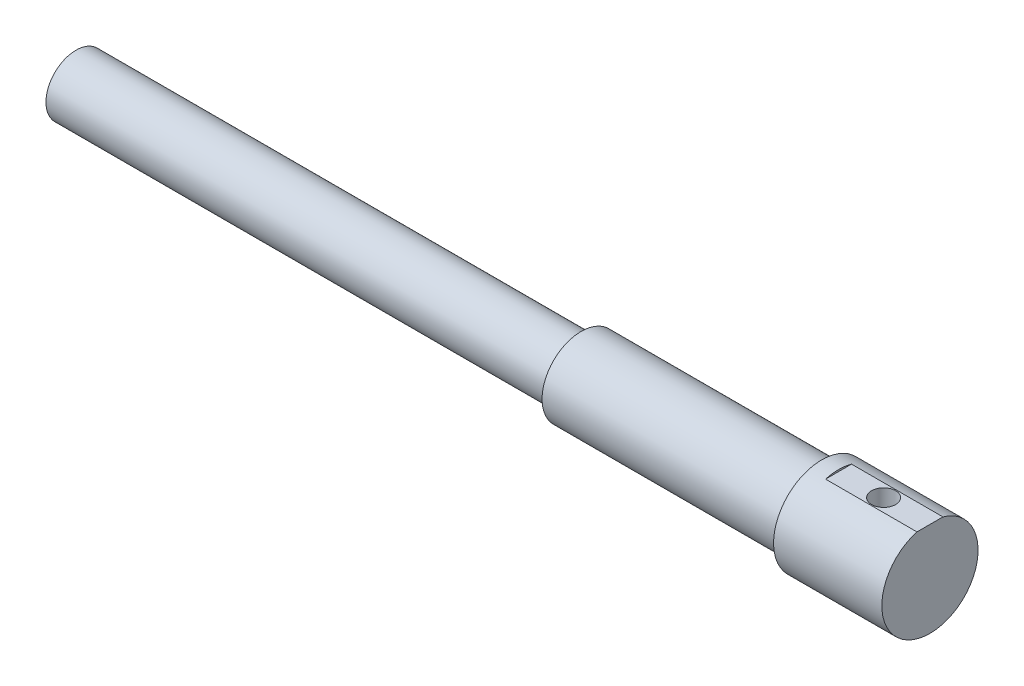
ISO-10303-21;
HEADER;
FILE_DESCRIPTION(('STEP AP214'),'2;1');
FILE_NAME('part.step','',(''),(''),'','','');
FILE_SCHEMA(('AUTOMOTIVE_DESIGN { 1 0 10303 214 1 1 1 1 }'));
ENDSEC;
DATA;
#1=APPLICATION_CONTEXT('core data for automotive mechanical design processes');
#2=APPLICATION_PROTOCOL_DEFINITION('international standard','automotive_design',2000,#1);
#3=PRODUCT_CONTEXT('',#1,'mechanical');
#4=PRODUCT('Part','Part','',(#3));
#5=PRODUCT_RELATED_PRODUCT_CATEGORY('part','',(#4));
#6=PRODUCT_DEFINITION_FORMATION('','',#4);
#7=PRODUCT_DEFINITION_CONTEXT('part definition',#1,'design');
#8=PRODUCT_DEFINITION('design','',#6,#7);
#9=PRODUCT_DEFINITION_SHAPE('','',#8);
#10=(LENGTH_UNIT() NAMED_UNIT(*) SI_UNIT(.MILLI.,.METRE.));
#11=(NAMED_UNIT(*) PLANE_ANGLE_UNIT() SI_UNIT($,.RADIAN.));
#12=(NAMED_UNIT(*) SI_UNIT($,.STERADIAN.) SOLID_ANGLE_UNIT());
#13=UNCERTAINTY_MEASURE_WITH_UNIT(LENGTH_MEASURE(1.E-05),#10,'distance_accuracy_value','');
#14=(GEOMETRIC_REPRESENTATION_CONTEXT(3) GLOBAL_UNCERTAINTY_ASSIGNED_CONTEXT((#13)) GLOBAL_UNIT_ASSIGNED_CONTEXT((#10,
#11,#12)) REPRESENTATION_CONTEXT('',''));
#15=CARTESIAN_POINT('',(0.,0.,0.));
#16=DIRECTION('',(0.,0.,1.));
#17=DIRECTION('',(1.,0.,0.));
#18=AXIS2_PLACEMENT_3D('',#15,#16,#17);
#19=CARTESIAN_POINT('',(210.,0.,0.));
#20=DIRECTION('',(-1.,0.,0.));
#21=DIRECTION('',(0.,0.,1.));
#22=AXIS2_PLACEMENT_3D('',#19,#20,#21);
#23=CYLINDRICAL_SURFACE('',#22,12.5);
#24=CARTESIAN_POINT('',(210.,0.,0.));
#25=DIRECTION('',(1.,0.,0.));
#26=DIRECTION('',(0.,0.,-1.));
#27=AXIS2_PLACEMENT_3D('',#24,#25,#26);
#28=CIRCLE('',#27,12.5);
#29=CARTESIAN_POINT('',(210.,0.,-12.5));
#30=VERTEX_POINT('',#29);
#31=EDGE_CURVE('E50',#30,#30,#28,.T.);
#32=ORIENTED_EDGE('',*,*,#31,.F.);
#33=EDGE_LOOP('',(#32));
#34=FACE_BOUND('',#33,.T.);
#35=CARTESIAN_POINT('',(0.,0.,0.));
#36=DIRECTION('',(1.,0.,0.));
#37=DIRECTION('',(0.,0.,-1.));
#38=AXIS2_PLACEMENT_3D('',#35,#36,#37);
#39=CIRCLE('',#38,12.5);
#40=CARTESIAN_POINT('',(0.,0.,-12.5));
#41=VERTEX_POINT('',#40);
#42=EDGE_CURVE('E93',#41,#41,#39,.T.);
#43=ORIENTED_EDGE('',*,*,#42,.T.);
#44=EDGE_LOOP('',(#43));
#45=FACE_BOUND('',#44,.T.);
#46=ADVANCED_FACE('F43',(#34,#45),#23,.T.);
#47=CARTESIAN_POINT('',(0.,0.,0.));
#48=DIRECTION('',(1.,0.,0.));
#49=DIRECTION('',(0.,0.,-1.));
#50=AXIS2_PLACEMENT_3D('',#47,#48,#49);
#51=PLANE('',#50);
#52=ORIENTED_EDGE('',*,*,#42,.F.);
#53=EDGE_LOOP('',(#52));
#54=FACE_BOUND('',#53,.T.);
#55=ADVANCED_FACE('F100',(#54),#51,.F.);
#56=CARTESIAN_POINT('',(310.,0.,0.));
#57=DIRECTION('',(-1.,0.,0.));
#58=DIRECTION('',(0.,0.,1.));
#59=AXIS2_PLACEMENT_3D('',#56,#57,#58);
#60=CYLINDRICAL_SURFACE('',#59,16.25);
#61=CARTESIAN_POINT('',(310.,0.,0.));
#62=DIRECTION('',(1.,0.,0.));
#63=DIRECTION('',(0.,0.,-1.));
#64=AXIS2_PLACEMENT_3D('',#61,#62,#63);
#65=CIRCLE('',#64,16.25);
#66=CARTESIAN_POINT('',(310.,0.,-16.25));
#67=VERTEX_POINT('',#66);
#68=EDGE_CURVE('E86',#67,#67,#65,.T.);
#69=ORIENTED_EDGE('',*,*,#68,.F.);
#70=EDGE_LOOP('',(#69));
#71=FACE_BOUND('',#70,.T.);
#72=CARTESIAN_POINT('',(210.,0.,0.));
#73=DIRECTION('',(1.,0.,0.));
#74=DIRECTION('',(0.,0.,-1.));
#75=AXIS2_PLACEMENT_3D('',#72,#73,#74);
#76=CIRCLE('',#75,16.25);
#77=CARTESIAN_POINT('',(210.,0.,-16.25));
#78=VERTEX_POINT('',#77);
#79=EDGE_CURVE('E83',#78,#78,#76,.T.);
#80=ORIENTED_EDGE('',*,*,#79,.T.);
#81=EDGE_LOOP('',(#80));
#82=FACE_BOUND('',#81,.T.);
#83=ADVANCED_FACE('F102',(#71,#82),#60,.T.);
#84=CARTESIAN_POINT('',(210.,0.,0.));
#85=DIRECTION('',(1.,0.,0.));
#86=DIRECTION('',(0.,0.,-1.));
#87=AXIS2_PLACEMENT_3D('',#84,#85,#86);
#88=PLANE('',#87);
#89=ORIENTED_EDGE('',*,*,#31,.T.);
#90=EDGE_LOOP('',(#89));
#91=FACE_BOUND('',#90,.T.);
#92=ORIENTED_EDGE('',*,*,#79,.F.);
#93=EDGE_LOOP('',(#92));
#94=FACE_BOUND('',#93,.T.);
#95=ADVANCED_FACE('F107',(#91,#94),#88,.F.);
#96=CARTESIAN_POINT('',(355.,0.,0.));
#97=DIRECTION('',(-1.,0.,0.));
#98=DIRECTION('',(0.,0.,1.));
#99=AXIS2_PLACEMENT_3D('',#96,#97,#98);
#100=CYLINDRICAL_SURFACE('',#99,20.);
#101=CARTESIAN_POINT('',(335.730152453308,-19.3649167310371,4.99999999999999));
#102=CARTESIAN_POINT('',(335.454050951455,-19.3649220017572,4.99999215718613));
#103=CARTESIAN_POINT('',(335.177862655951,-19.3708861202919,4.97705249099528));
#104=CARTESIAN_POINT('',(334.633417296961,-19.3940372398513,4.88604625092757));
#105=CARTESIAN_POINT('',(334.365164944371,-19.4112307724326,4.8179534134842));
#106=CARTESIAN_POINT('',(333.844545376933,-19.454774491923,4.63898239926408));
#107=CARTESIAN_POINT('',(333.592158142536,-19.4811128538092,4.52815945570898));
#108=CARTESIAN_POINT('',(333.109530748228,-19.5399638405752,4.26704228252277));
#109=CARTESIAN_POINT('',(332.879291529147,-19.5724767275698,4.11674637712138));
#110=CARTESIAN_POINT('',(332.442429162783,-19.6408143271125,3.77741685462377));
#111=CARTESIAN_POINT('',(332.236365252608,-19.6766919524607,3.58767377540811));
#112=CARTESIAN_POINT('',(331.858629664587,-19.7472575103059,3.17636412820133));
#113=CARTESIAN_POINT('',(331.686961202064,-19.7819453313278,2.95479458836061));
#114=CARTESIAN_POINT('',(331.380601518045,-19.8468083104117,2.4822904021579));
#115=CARTESIAN_POINT('',(331.246459676985,-19.8769137480118,2.23098915239024));
#116=CARTESIAN_POINT('',(331.022533165002,-19.9286162385197,1.70852636858554));
#117=CARTESIAN_POINT('',(330.932741949477,-19.9502145466869,1.43736777158391));
#118=CARTESIAN_POINT('',(330.801856784151,-19.9820951769636,0.888717517508367));
#119=CARTESIAN_POINT('',(330.759813164655,-19.9925978768862,0.611465439097993));
#120=CARTESIAN_POINT('',(330.722635694757,-20.001871882146,0.0536576385255715));
#121=CARTESIAN_POINT('',(330.727494908889,-20.0006449219342,-0.226897589076111));
#122=CARTESIAN_POINT('',(330.783302153808,-19.9867618990705,-0.776761235861903));
#123=CARTESIAN_POINT('',(330.833225103415,-19.9743600468169,-1.04618107800529));
#124=CARTESIAN_POINT('',(330.976094993405,-19.9398167304977,-1.57269123706842));
#125=CARTESIAN_POINT('',(331.069044224063,-19.917674747971,-1.82978089685224));
#126=CARTESIAN_POINT('',(331.296157594682,-19.8657501940157,-2.32703351750893));
#127=CARTESIAN_POINT('',(331.430686542631,-19.8359003938928,-2.56702254883222));
#128=CARTESIAN_POINT('',(331.736863811541,-19.7717980762013,-3.02137811170268));
#129=CARTESIAN_POINT('',(331.908518590431,-19.7375447930809,-3.2357401754285));
#130=CARTESIAN_POINT('',(332.28956993727,-19.6672742753585,-3.6388701754237));
#131=CARTESIAN_POINT('',(332.499862237995,-19.6312343903979,-3.82678839537204));
#132=CARTESIAN_POINT('',(332.949352400396,-19.5623008704547,-4.16488187981898));
#133=CARTESIAN_POINT('',(333.18855161232,-19.5294073825696,-4.31505538024469));
#134=CARTESIAN_POINT('',(333.690732521582,-19.4704099361798,-4.57394064510185));
#135=CARTESIAN_POINT('',(333.953823913834,-19.4443396728207,-4.68244783480343));
#136=CARTESIAN_POINT('',(334.495323389358,-19.4023728014569,-4.85342810313205));
#137=CARTESIAN_POINT('',(334.773728181245,-19.3864740164534,-4.91591103275194));
#138=CARTESIAN_POINT('',(335.33007145639,-19.3671071205401,-4.99165927734365));
#139=CARTESIAN_POINT('',(335.607828039996,-19.3633217796434,-5.00618094784139));
#140=CARTESIAN_POINT('',(336.161796326472,-19.3677468671892,-4.98903398102715));
#141=CARTESIAN_POINT('',(336.438008169205,-19.3759561913782,-4.95736959569876));
#142=CARTESIAN_POINT('',(336.976380983206,-19.403141639727,-4.84985092787733));
#143=CARTESIAN_POINT('',(337.238697906447,-19.421939404858,-4.77472813656403));
#144=CARTESIAN_POINT('',(337.747015369014,-19.4680143652488,-4.5832361633407));
#145=CARTESIAN_POINT('',(337.993013971419,-19.4952925649262,-4.46686209542495));
#146=CARTESIAN_POINT('',(338.467035009042,-19.5559227419123,-4.19354133587328));
#147=CARTESIAN_POINT('',(338.694610133394,-19.5893833721454,-4.03584350767132));
#148=CARTESIAN_POINT('',(339.120529178911,-19.6583416614217,-3.68530146467226));
#149=CARTESIAN_POINT('',(339.318868286608,-19.693839654566,-3.4924514740272));
#150=CARTESIAN_POINT('',(339.68577453845,-19.7639480606356,-3.07131360492365));
#151=CARTESIAN_POINT('',(339.853472578405,-19.7985140412376,-2.84225976265797));
#152=CARTESIAN_POINT('',(340.14802418721,-19.8619443322737,-2.35851341347337));
#153=CARTESIAN_POINT('',(340.274879886524,-19.890808940079,-2.10382224478795));
#154=CARTESIAN_POINT('',(340.483044522364,-19.9394023147665,-1.57779100865545));
#155=CARTESIAN_POINT('',(340.564681022066,-19.9591966004482,-1.30658690513941));
#156=CARTESIAN_POINT('',(340.681073122525,-19.9877058679158,-0.753748801594043));
#157=CARTESIAN_POINT('',(340.715837770786,-19.9964229878684,-0.472116825206219));
#158=CARTESIAN_POINT('',(340.736990401185,-20.0017084704403,0.0854176322165862));
#159=CARTESIAN_POINT('',(340.724660998785,-19.9985989439994,0.361269134830075));
#160=CARTESIAN_POINT('',(340.654913316836,-19.9812948228722,0.906837482073722));
#161=CARTESIAN_POINT('',(340.597496378242,-19.9671005578585,1.17655450890462));
#162=CARTESIAN_POINT('',(340.439891354453,-19.9292716426945,1.70085517822384));
#163=CARTESIAN_POINT('',(340.339935186736,-19.9056882251196,1.95551247290427));
#164=CARTESIAN_POINT('',(340.10029955821,-19.8515644456829,2.44458526520808));
#165=CARTESIAN_POINT('',(339.960615089955,-19.8210232069379,2.67899820632814));
#166=CARTESIAN_POINT('',(339.641576283327,-19.7553624840144,3.12700964211649));
#167=CARTESIAN_POINT('',(339.461351738789,-19.7201508470832,3.33997494149164));
#168=CARTESIAN_POINT('',(339.068038193421,-19.6495324528595,3.73307510136748));
#169=CARTESIAN_POINT('',(338.854940872752,-19.6141256483651,3.91320162538292));
#170=CARTESIAN_POINT('',(338.39714538236,-19.5463737922751,4.23881013235914));
#171=CARTESIAN_POINT('',(338.151931836482,-19.5140981836644,4.38358309708188));
#172=CARTESIAN_POINT('',(337.639875003934,-19.4571977747414,4.62963448292733));
#173=CARTESIAN_POINT('',(337.373047622839,-19.4325674116607,4.73094454876075));
#174=CARTESIAN_POINT('',(336.877267394132,-19.3975954375369,4.872112642855));
#175=CARTESIAN_POINT('',(336.650686631377,-19.3854331501749,4.91996585298438));
#176=CARTESIAN_POINT('',(336.192808108319,-19.369091929131,4.98391146285884));
#177=CARTESIAN_POINT('',(335.961510752086,-19.3649123144554,5.00000657185874));
#178=CARTESIAN_POINT('',(335.730152453308,-19.3649167310371,4.99999999999999));
#179=B_SPLINE_CURVE_WITH_KNOTS('',3,(#101,#102,#103,#104,#105,#106,#107,#108,#109,#110,#111,
#112,#113,#114,#115,#116,#117,#118,#119,#120,#121,#122,#123,#124,#125,#126,#127,#128,#129,#130,
#131,#132,#133,#134,#135,#136,#137,#138,#139,#140,#141,#142,#143,#144,#145,#146,#147,#148,#149,
#150,#151,#152,#153,#154,#155,#156,#157,#158,#159,#160,#161,#162,#163,#164,#165,#166,#167,#168,
#169,#170,#171,#172,#173,#174,#175,#176,#177,#178),.UNSPECIFIED.,.T.,.F.,(4,2,2,2,2,2,2,2,2,2,2,
2,2,2,2,2,2,2,2,2,2,2,2,2,2,2,2,2,2,2,2,2,2,2,2,2,2,2,4),(0.,0.827454883472299,1.65539148285731,
2.48226145433198,3.30916653510954,4.1524790838595,4.99587042959732,5.85102992795837,
6.70606319694179,7.54377501990688,8.38136297332037,9.2003652537789,10.0194111344957,
10.8458574850888,11.6724477093782,12.5214093314382,13.370410623996,14.2235286401916,
15.0764640026416,15.9068714953348,16.7372025438256,17.5539481003337,18.3707904285779,
19.2036569173327,20.0366603778505,20.8905066194559,21.7443083145406,22.5918414562882,
23.4392109783303,24.2636689226987,25.0881023476892,25.9080975313438,26.728196114911,
27.567941931791,28.4079006314597,29.2635295458733,30.118534427551,30.8119565437651,
31.505319502209),.UNSPECIFIED.);
#180=CARTESIAN_POINT('',(335.730152453308,-19.3649167310371,4.99999999999999));
#181=VERTEX_POINT('',#180);
#182=EDGE_CURVE('E73',#181,#181,#179,.T.);
#183=ORIENTED_EDGE('',*,*,#182,.F.);
#184=EDGE_LOOP('',(#183));
#185=FACE_BOUND('',#184,.T.);
#186=CARTESIAN_POINT('',(317.,0.,0.));
#187=DIRECTION('',(1.,0.,0.));
#188=DIRECTION('',(0.,0.,-1.));
#189=AXIS2_PLACEMENT_3D('',#186,#187,#188);
#190=CIRCLE('',#189,20.);
#191=CARTESIAN_POINT('',(317.,19.2572492440759,-5.39984736372587));
#192=VERTEX_POINT('',#191);
#193=CARTESIAN_POINT('',(317.,19.2572492440759,5.39984736372587));
#194=VERTEX_POINT('',#193);
#195=EDGE_CURVE('E11',#192,#194,#190,.T.);
#196=ORIENTED_EDGE('',*,*,#195,.F.);
#197=DIRECTION('',(1.,0.,0.));
#198=VECTOR('',#197,1.);
#199=CARTESIAN_POINT('',(317.,19.2572492440759,-5.39984736372587));
#200=LINE('',#199,#198);
#201=CARTESIAN_POINT('',(355.,19.2572492440759,-5.39984736372587));
#202=VERTEX_POINT('',#201);
#203=EDGE_CURVE('E63',#192,#202,#200,.T.);
#204=ORIENTED_EDGE('',*,*,#203,.T.);
#205=CARTESIAN_POINT('',(355.,0.,0.));
#206=DIRECTION('',(1.,0.,0.));
#207=DIRECTION('',(0.,0.,-1.));
#208=AXIS2_PLACEMENT_3D('',#205,#206,#207);
#209=CIRCLE('',#208,20.);
#210=CARTESIAN_POINT('',(355.,19.2572492440759,5.39984736372587));
#211=VERTEX_POINT('',#210);
#212=EDGE_CURVE('E79',#211,#202,#209,.T.);
#213=ORIENTED_EDGE('',*,*,#212,.F.);
#214=DIRECTION('',(1.,0.,0.));
#215=VECTOR('',#214,1.);
#216=CARTESIAN_POINT('',(317.,19.2572492440759,5.39984736372587));
#217=LINE('',#216,#215);
#218=EDGE_CURVE('E57',#194,#211,#217,.T.);
#219=ORIENTED_EDGE('',*,*,#218,.F.);
#220=EDGE_LOOP('',(#196,#204,#213,#219));
#221=FACE_BOUND('',#220,.T.);
#222=CARTESIAN_POINT('',(310.,0.,0.));
#223=DIRECTION('',(1.,0.,0.));
#224=DIRECTION('',(0.,0.,-1.));
#225=AXIS2_PLACEMENT_3D('',#222,#223,#224);
#226=CIRCLE('',#225,20.);
#227=CARTESIAN_POINT('',(310.,0.,-20.));
#228=VERTEX_POINT('',#227);
#229=EDGE_CURVE('E80',#228,#228,#226,.T.);
#230=ORIENTED_EDGE('',*,*,#229,.T.);
#231=EDGE_LOOP('',(#230));
#232=FACE_BOUND('',#231,.T.);
#233=ADVANCED_FACE('F77',(#185,#221,#232),#100,.T.);
#234=CARTESIAN_POINT('',(355.,0.,0.));
#235=DIRECTION('',(1.,0.,0.));
#236=DIRECTION('',(0.,0.,-1.));
#237=AXIS2_PLACEMENT_3D('',#234,#235,#236);
#238=PLANE('',#237);
#239=DIRECTION('',(0.,0.,-1.));
#240=VECTOR('',#239,1.);
#241=CARTESIAN_POINT('',(355.,19.2572492440759,5.39984736372587));
#242=LINE('',#241,#240);
#243=EDGE_CURVE('E67',#211,#202,#242,.T.);
#244=ORIENTED_EDGE('',*,*,#243,.F.);
#245=ORIENTED_EDGE('',*,*,#212,.T.);
#246=EDGE_LOOP('',(#244,#245));
#247=FACE_BOUND('',#246,.T.);
#248=ADVANCED_FACE('F82',(#247),#238,.T.);
#249=CARTESIAN_POINT('',(310.,0.,0.));
#250=DIRECTION('',(1.,0.,0.));
#251=DIRECTION('',(0.,0.,-1.));
#252=AXIS2_PLACEMENT_3D('',#249,#250,#251);
#253=PLANE('',#252);
#254=ORIENTED_EDGE('',*,*,#68,.T.);
#255=EDGE_LOOP('',(#254));
#256=FACE_BOUND('',#255,.T.);
#257=ORIENTED_EDGE('',*,*,#229,.F.);
#258=EDGE_LOOP('',(#257));
#259=FACE_BOUND('',#258,.T.);
#260=ADVANCED_FACE('F118',(#256,#259),#253,.F.);
#261=CARTESIAN_POINT('',(317.,0.,0.));
#262=DIRECTION('',(1.,0.,0.));
#263=DIRECTION('',(0.,0.,-1.));
#264=AXIS2_PLACEMENT_3D('',#261,#262,#263);
#265=PLANE('',#264);
#266=ORIENTED_EDGE('',*,*,#195,.T.);
#267=DIRECTION('',(0.,0.,-1.));
#268=VECTOR('',#267,1.);
#269=CARTESIAN_POINT('',(317.,19.2572492440759,5.39984736372587));
#270=LINE('',#269,#268);
#271=EDGE_CURVE('E72',#194,#192,#270,.T.);
#272=ORIENTED_EDGE('',*,*,#271,.T.);
#273=EDGE_LOOP('',(#266,#272));
#274=FACE_BOUND('',#273,.T.);
#275=ADVANCED_FACE('F121',(#274),#265,.T.);
#276=CARTESIAN_POINT('',(317.,19.2572492440759,5.39984736372587));
#277=DIRECTION('',(0.,-1.,0.));
#278=DIRECTION('',(0.,0.,-1.));
#279=AXIS2_PLACEMENT_3D('',#276,#277,#278);
#280=PLANE('',#279);
#281=CARTESIAN_POINT('',(335.730152453308,19.2572492440759,0.));
#282=DIRECTION('',(0.,1.,0.));
#283=DIRECTION('',(0.,0.,1.));
#284=AXIS2_PLACEMENT_3D('',#281,#282,#283);
#285=CIRCLE('',#284,4.99999999999999);
#286=CARTESIAN_POINT('',(335.730152453308,19.2572492440759,4.99999999999999));
#287=VERTEX_POINT('',#286);
#288=EDGE_CURVE('E144',#287,#287,#285,.T.);
#289=ORIENTED_EDGE('',*,*,#288,.F.);
#290=EDGE_LOOP('',(#289));
#291=FACE_BOUND('',#290,.T.);
#292=ORIENTED_EDGE('',*,*,#243,.T.);
#293=ORIENTED_EDGE('',*,*,#203,.F.);
#294=ORIENTED_EDGE('',*,*,#271,.F.);
#295=ORIENTED_EDGE('',*,*,#218,.T.);
#296=EDGE_LOOP('',(#292,#293,#294,#295));
#297=FACE_BOUND('',#296,.T.);
#298=ADVANCED_FACE('F68',(#291,#297),#280,.F.);
#299=CARTESIAN_POINT('',(335.730152453308,-20.001,0.));
#300=DIRECTION('',(0.,1.,0.));
#301=DIRECTION('',(0.,0.,1.));
#302=AXIS2_PLACEMENT_3D('',#299,#300,#301);
#303=CYLINDRICAL_SURFACE('',#302,4.99999999999999);
#304=ORIENTED_EDGE('',*,*,#288,.T.);
#305=EDGE_LOOP('',(#304));
#306=FACE_BOUND('',#305,.T.);
#307=ORIENTED_EDGE('',*,*,#182,.T.);
#308=EDGE_LOOP('',(#307));
#309=FACE_BOUND('',#308,.T.);
#310=ADVANCED_FACE('F127',(#306,#309),#303,.F.);
#311=CLOSED_SHELL('',(#46,#55,#83,#95,#233,#248,#260,#275,#298,#310));
#312=MANIFOLD_SOLID_BREP('B2',#311);
#313=ADVANCED_BREP_SHAPE_REPRESENTATION('',(#18,#312),#14);
#314=SHAPE_DEFINITION_REPRESENTATION(#9,#313);
ENDSEC;
END-ISO-10303-21;
